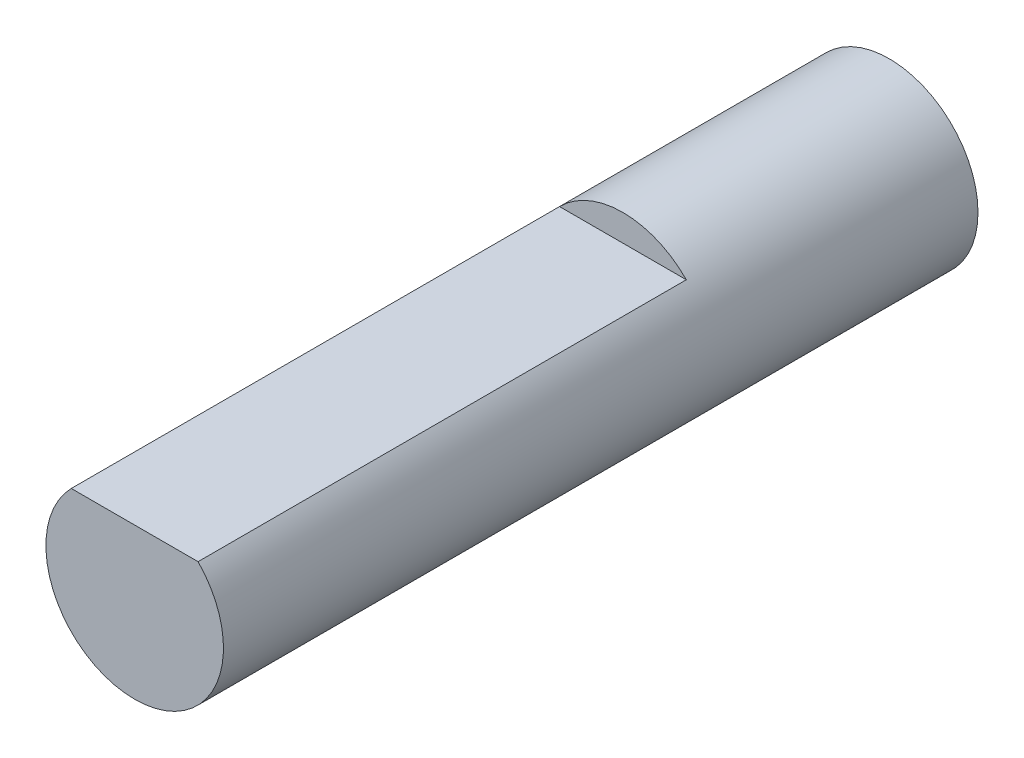
ISO-10303-21;
HEADER;
FILE_DESCRIPTION(('STEP AP214'),'2;1');
FILE_NAME('part.step','',(''),(''),'','','');
FILE_SCHEMA(('AUTOMOTIVE_DESIGN { 1 0 10303 214 1 1 1 1 }'));
ENDSEC;
DATA;
#1=APPLICATION_CONTEXT('core data for automotive mechanical design processes');
#2=APPLICATION_PROTOCOL_DEFINITION('international standard','automotive_design',2000,#1);
#3=PRODUCT_CONTEXT('',#1,'mechanical');
#4=PRODUCT('Part','Part','',(#3));
#5=PRODUCT_RELATED_PRODUCT_CATEGORY('part','',(#4));
#6=PRODUCT_DEFINITION_FORMATION('','',#4);
#7=PRODUCT_DEFINITION_CONTEXT('part definition',#1,'design');
#8=PRODUCT_DEFINITION('design','',#6,#7);
#9=PRODUCT_DEFINITION_SHAPE('','',#8);
#10=(LENGTH_UNIT() NAMED_UNIT(*) SI_UNIT(.MILLI.,.METRE.));
#11=(NAMED_UNIT(*) PLANE_ANGLE_UNIT() SI_UNIT($,.RADIAN.));
#12=(NAMED_UNIT(*) SI_UNIT($,.STERADIAN.) SOLID_ANGLE_UNIT());
#13=UNCERTAINTY_MEASURE_WITH_UNIT(LENGTH_MEASURE(1.E-05),#10,'distance_accuracy_value','');
#14=(GEOMETRIC_REPRESENTATION_CONTEXT(3) GLOBAL_UNCERTAINTY_ASSIGNED_CONTEXT((#13)) GLOBAL_UNIT_ASSIGNED_CONTEXT((#10,
#11,#12)) REPRESENTATION_CONTEXT('',''));
#15=CARTESIAN_POINT('',(0.,0.,0.));
#16=DIRECTION('',(0.,0.,1.));
#17=DIRECTION('',(1.,0.,0.));
#18=AXIS2_PLACEMENT_3D('',#15,#16,#17);
#19=CARTESIAN_POINT('',(0.,0.,17.));
#20=DIRECTION('',(0.,0.,-1.));
#21=DIRECTION('',(-1.,0.,0.));
#22=AXIS2_PLACEMENT_3D('',#19,#20,#21);
#23=CYLINDRICAL_SURFACE('',#22,2.);
#24=CARTESIAN_POINT('',(0.,0.,17.));
#25=DIRECTION('',(0.,0.,1.));
#26=DIRECTION('',(1.,0.,0.));
#27=AXIS2_PLACEMENT_3D('',#24,#25,#26);
#28=CIRCLE('',#27,2.);
#29=CARTESIAN_POINT('',(-1.42828568570857,1.4,17.));
#30=VERTEX_POINT('',#29);
#31=CARTESIAN_POINT('',(1.42828568570857,1.4,17.));
#32=VERTEX_POINT('',#31);
#33=EDGE_CURVE('E11',#30,#32,#28,.T.);
#34=ORIENTED_EDGE('',*,*,#33,.F.);
#35=DIRECTION('',(0.,0.,1.));
#36=VECTOR('',#35,1.);
#37=CARTESIAN_POINT('',(-1.42828568570857,1.4,6.));
#38=LINE('',#37,#36);
#39=CARTESIAN_POINT('',(-1.42828568570857,1.4,6.));
#40=VERTEX_POINT('',#39);
#41=EDGE_CURVE('E58',#40,#30,#38,.T.);
#42=ORIENTED_EDGE('',*,*,#41,.F.);
#43=CARTESIAN_POINT('',(0.,0.,6.));
#44=DIRECTION('',(0.,0.,1.));
#45=DIRECTION('',(1.,0.,0.));
#46=AXIS2_PLACEMENT_3D('',#43,#44,#45);
#47=CIRCLE('',#46,2.);
#48=CARTESIAN_POINT('',(1.42828568570857,1.4,6.));
#49=VERTEX_POINT('',#48);
#50=EDGE_CURVE('E73',#49,#40,#47,.T.);
#51=ORIENTED_EDGE('',*,*,#50,.F.);
#52=DIRECTION('',(0.,0.,1.));
#53=VECTOR('',#52,1.);
#54=CARTESIAN_POINT('',(1.42828568570857,1.4,6.));
#55=LINE('',#54,#53);
#56=EDGE_CURVE('E64',#49,#32,#55,.T.);
#57=ORIENTED_EDGE('',*,*,#56,.T.);
#58=EDGE_LOOP('',(#34,#42,#51,#57));
#59=FACE_BOUND('',#58,.T.);
#60=CARTESIAN_POINT('',(0.,0.,0.));
#61=DIRECTION('',(0.,0.,1.));
#62=DIRECTION('',(1.,0.,0.));
#63=AXIS2_PLACEMENT_3D('',#60,#61,#62);
#64=CIRCLE('',#63,2.);
#65=CARTESIAN_POINT('',(2.,0.,0.));
#66=VERTEX_POINT('',#65);
#67=EDGE_CURVE('E47',#66,#66,#64,.T.);
#68=ORIENTED_EDGE('',*,*,#67,.T.);
#69=EDGE_LOOP('',(#68));
#70=FACE_BOUND('',#69,.T.);
#71=ADVANCED_FACE('F44',(#59,#70),#23,.T.);
#72=CARTESIAN_POINT('',(0.,0.,17.));
#73=DIRECTION('',(0.,0.,1.));
#74=DIRECTION('',(1.,0.,0.));
#75=AXIS2_PLACEMENT_3D('',#72,#73,#74);
#76=PLANE('',#75);
#77=DIRECTION('',(1.,0.,0.));
#78=VECTOR('',#77,1.);
#79=CARTESIAN_POINT('',(-1.42828568570857,1.4,17.));
#80=LINE('',#79,#78);
#81=EDGE_CURVE('E69',#30,#32,#80,.T.);
#82=ORIENTED_EDGE('',*,*,#81,.F.);
#83=ORIENTED_EDGE('',*,*,#33,.T.);
#84=EDGE_LOOP('',(#82,#83));
#85=FACE_BOUND('',#84,.T.);
#86=ADVANCED_FACE('F79',(#85),#76,.T.);
#87=CARTESIAN_POINT('',(0.,0.,0.));
#88=DIRECTION('',(0.,0.,1.));
#89=DIRECTION('',(1.,0.,0.));
#90=AXIS2_PLACEMENT_3D('',#87,#88,#89);
#91=PLANE('',#90);
#92=ORIENTED_EDGE('',*,*,#67,.F.);
#93=EDGE_LOOP('',(#92));
#94=FACE_BOUND('',#93,.T.);
#95=ADVANCED_FACE('F81',(#94),#91,.F.);
#96=CARTESIAN_POINT('',(-1.42828568570857,1.4,6.));
#97=DIRECTION('',(0.,-1.,0.));
#98=DIRECTION('',(0.,0.,-1.));
#99=AXIS2_PLACEMENT_3D('',#96,#97,#98);
#100=PLANE('',#99);
#101=ORIENTED_EDGE('',*,*,#81,.T.);
#102=ORIENTED_EDGE('',*,*,#56,.F.);
#103=DIRECTION('',(1.,0.,0.));
#104=VECTOR('',#103,1.);
#105=CARTESIAN_POINT('',(-1.42828568570857,1.4,6.));
#106=LINE('',#105,#104);
#107=EDGE_CURVE('E96',#40,#49,#106,.T.);
#108=ORIENTED_EDGE('',*,*,#107,.F.);
#109=ORIENTED_EDGE('',*,*,#41,.T.);
#110=EDGE_LOOP('',(#101,#102,#108,#109));
#111=FACE_BOUND('',#110,.T.);
#112=ADVANCED_FACE('F70',(#111),#100,.F.);
#113=CARTESIAN_POINT('',(0.,0.,6.));
#114=DIRECTION('',(0.,0.,1.));
#115=DIRECTION('',(1.,0.,0.));
#116=AXIS2_PLACEMENT_3D('',#113,#114,#115);
#117=PLANE('',#116);
#118=ORIENTED_EDGE('',*,*,#50,.T.);
#119=ORIENTED_EDGE('',*,*,#107,.T.);
#120=EDGE_LOOP('',(#118,#119));
#121=FACE_BOUND('',#120,.T.);
#122=ADVANCED_FACE('F91',(#121),#117,.T.);
#123=CLOSED_SHELL('',(#71,#86,#95,#112,#122));
#124=MANIFOLD_SOLID_BREP('B2',#123);
#125=ADVANCED_BREP_SHAPE_REPRESENTATION('',(#18,#124),#14);
#126=SHAPE_DEFINITION_REPRESENTATION(#9,#125);
ENDSEC;
END-ISO-10303-21;
